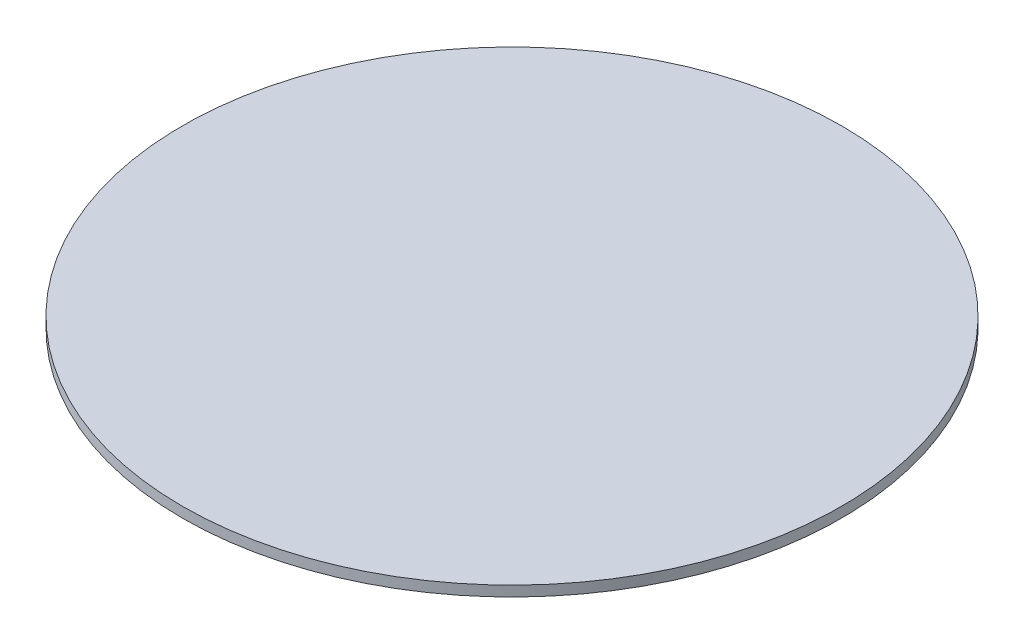
ISO-10303-21;
HEADER;
FILE_DESCRIPTION(('STEP AP214'),'2;1');
FILE_NAME('part.step','',(''),(''),'','','');
FILE_SCHEMA(('AUTOMOTIVE_DESIGN { 1 0 10303 214 1 1 1 1 }'));
ENDSEC;
DATA;
#1=APPLICATION_CONTEXT('core data for automotive mechanical design processes');
#2=APPLICATION_PROTOCOL_DEFINITION('international standard','automotive_design',2000,#1);
#3=PRODUCT_CONTEXT('',#1,'mechanical');
#4=PRODUCT('Part','Part','',(#3));
#5=PRODUCT_RELATED_PRODUCT_CATEGORY('part','',(#4));
#6=PRODUCT_DEFINITION_FORMATION('','',#4);
#7=PRODUCT_DEFINITION_CONTEXT('part definition',#1,'design');
#8=PRODUCT_DEFINITION('design','',#6,#7);
#9=PRODUCT_DEFINITION_SHAPE('','',#8);
#10=(LENGTH_UNIT() NAMED_UNIT(*) SI_UNIT(.MILLI.,.METRE.));
#11=(NAMED_UNIT(*) PLANE_ANGLE_UNIT() SI_UNIT($,.RADIAN.));
#12=(NAMED_UNIT(*) SI_UNIT($,.STERADIAN.) SOLID_ANGLE_UNIT());
#13=UNCERTAINTY_MEASURE_WITH_UNIT(LENGTH_MEASURE(1.E-05),#10,'distance_accuracy_value','');
#14=(GEOMETRIC_REPRESENTATION_CONTEXT(3) GLOBAL_UNCERTAINTY_ASSIGNED_CONTEXT((#13)) GLOBAL_UNIT_ASSIGNED_CONTEXT((#10,
#11,#12)) REPRESENTATION_CONTEXT('',''));
#15=CARTESIAN_POINT('',(0.,0.,0.));
#16=DIRECTION('',(0.,0.,1.));
#17=DIRECTION('',(1.,0.,0.));
#18=AXIS2_PLACEMENT_3D('',#15,#16,#17);
#19=CARTESIAN_POINT('',(0.,1.59,0.));
#20=DIRECTION('',(0.,-1.,0.));
#21=DIRECTION('',(0.,0.,-1.));
#22=AXIS2_PLACEMENT_3D('',#19,#20,#21);
#23=CYLINDRICAL_SURFACE('',#22,50.8);
#24=CARTESIAN_POINT('',(0.,1.59,0.));
#25=DIRECTION('',(0.,1.,0.));
#26=DIRECTION('',(0.,0.,1.));
#27=AXIS2_PLACEMENT_3D('',#24,#25,#26);
#28=CIRCLE('',#27,50.8);
#29=CARTESIAN_POINT('',(0.,1.59,-50.8));
#30=VERTEX_POINT('',#29);
#31=EDGE_CURVE('E10',#30,#30,#28,.T.);
#32=CARTESIAN_POINT('',(0.,0.,0.));
#33=DIRECTION('',(0.,1.,0.));
#34=DIRECTION('',(0.,0.,1.));
#35=AXIS2_PLACEMENT_3D('',#32,#33,#34);
#36=CIRCLE('',#35,50.8);
#37=CARTESIAN_POINT('',(0.,0.,-50.8));
#38=VERTEX_POINT('',#37);
#39=EDGE_CURVE('E35',#38,#38,#36,.T.);
#40=CARTESIAN_POINT('',(0.,1.59,-50.8));
#41=CARTESIAN_POINT('',(0.,1.5734375,-50.8));
#42=CARTESIAN_POINT('',(0.,1.556875,-50.8));
#43=CARTESIAN_POINT('',(0.,1.52375,-50.8));
#44=CARTESIAN_POINT('',(0.,1.5071875,-50.8));
#45=CARTESIAN_POINT('',(0.,1.4740625,-50.8));
#46=CARTESIAN_POINT('',(0.,1.4575,-50.8));
#47=CARTESIAN_POINT('',(0.,1.424375,-50.8));
#48=CARTESIAN_POINT('',(0.,1.4078125,-50.8));
#49=CARTESIAN_POINT('',(0.,1.3746875,-50.8));
#50=CARTESIAN_POINT('',(0.,1.358125,-50.8));
#51=CARTESIAN_POINT('',(0.,1.325,-50.8));
#52=CARTESIAN_POINT('',(0.,1.3084375,-50.8));
#53=CARTESIAN_POINT('',(0.,1.2753125,-50.8));
#54=CARTESIAN_POINT('',(0.,1.25875,-50.8));
#55=CARTESIAN_POINT('',(0.,1.225625,-50.8));
#56=CARTESIAN_POINT('',(0.,1.2090625,-50.8));
#57=CARTESIAN_POINT('',(0.,1.1759375,-50.8));
#58=CARTESIAN_POINT('',(0.,1.159375,-50.8));
#59=CARTESIAN_POINT('',(0.,1.12625,-50.8));
#60=CARTESIAN_POINT('',(0.,1.1096875,-50.8));
#61=CARTESIAN_POINT('',(0.,1.0765625,-50.8));
#62=CARTESIAN_POINT('',(0.,1.06,-50.8));
#63=CARTESIAN_POINT('',(0.,1.026875,-50.8));
#64=CARTESIAN_POINT('',(0.,1.0103125,-50.8));
#65=CARTESIAN_POINT('',(0.,0.9771875,-50.8));
#66=CARTESIAN_POINT('',(0.,0.960625,-50.8));
#67=CARTESIAN_POINT('',(0.,0.9275,-50.8));
#68=CARTESIAN_POINT('',(0.,0.9109375,-50.8));
#69=CARTESIAN_POINT('',(0.,0.8778125,-50.8));
#70=CARTESIAN_POINT('',(0.,0.86125,-50.8));
#71=CARTESIAN_POINT('',(0.,0.828125,-50.8));
#72=CARTESIAN_POINT('',(0.,0.8115625,-50.8));
#73=CARTESIAN_POINT('',(0.,0.7784375,-50.8));
#74=CARTESIAN_POINT('',(0.,0.761875,-50.8));
#75=CARTESIAN_POINT('',(0.,0.72875,-50.8));
#76=CARTESIAN_POINT('',(0.,0.7121875,-50.8));
#77=CARTESIAN_POINT('',(0.,0.6790625,-50.8));
#78=CARTESIAN_POINT('',(0.,0.6625,-50.8));
#79=CARTESIAN_POINT('',(0.,0.629375,-50.8));
#80=CARTESIAN_POINT('',(0.,0.6128125,-50.8));
#81=CARTESIAN_POINT('',(0.,0.5796875,-50.8));
#82=CARTESIAN_POINT('',(0.,0.563125,-50.8));
#83=CARTESIAN_POINT('',(0.,0.53,-50.8));
#84=CARTESIAN_POINT('',(0.,0.5134375,-50.8));
#85=CARTESIAN_POINT('',(0.,0.4803125,-50.8));
#86=CARTESIAN_POINT('',(0.,0.46375,-50.8));
#87=CARTESIAN_POINT('',(0.,0.430625,-50.8));
#88=CARTESIAN_POINT('',(0.,0.4140625,-50.8));
#89=CARTESIAN_POINT('',(0.,0.3809375,-50.8));
#90=CARTESIAN_POINT('',(0.,0.364375,-50.8));
#91=CARTESIAN_POINT('',(0.,0.33125,-50.8));
#92=CARTESIAN_POINT('',(0.,0.3146875,-50.8));
#93=CARTESIAN_POINT('',(0.,0.2815625,-50.8));
#94=CARTESIAN_POINT('',(0.,0.265,-50.8));
#95=CARTESIAN_POINT('',(0.,0.231875,-50.8));
#96=CARTESIAN_POINT('',(0.,0.2153125,-50.8));
#97=CARTESIAN_POINT('',(0.,0.1821875,-50.8));
#98=CARTESIAN_POINT('',(0.,0.165625,-50.8));
#99=CARTESIAN_POINT('',(0.,0.1325,-50.8));
#100=CARTESIAN_POINT('',(0.,0.1159375,-50.8));
#101=CARTESIAN_POINT('',(0.,0.0828125000000001,-50.8));
#102=CARTESIAN_POINT('',(0.,0.06625,-50.8));
#103=CARTESIAN_POINT('',(0.,0.033125,-50.8));
#104=CARTESIAN_POINT('',(0.,0.0165625,-50.8));
#105=CARTESIAN_POINT('',(0.,0.,-50.8));
#106=B_SPLINE_CURVE_WITH_KNOTS('',3,(#40,#41,#42,#43,#44,#45,#46,#47,#48,#49,#50,#51,#52,#53,
#54,#55,#56,#57,#58,#59,#60,#61,#62,#63,#64,#65,#66,#67,#68,#69,#70,#71,#72,#73,#74,#75,#76,#77,
#78,#79,#80,#81,#82,#83,#84,#85,#86,#87,#88,#89,#90,#91,#92,#93,#94,#95,#96,#97,#98,#99,#100,
#101,#102,#103,#104,#105),.UNSPECIFIED.,.F.,.F.,(4,2,2,2,2,2,2,2,2,2,2,2,2,2,2,2,2,2,2,2,2,2,2,
2,2,2,2,2,2,2,2,2,4),(0.,0.0496874999999998,0.0993749999999999,0.1490625,0.19875,0.2484375,
0.298125,0.3478125,0.3975,0.4471875,0.496875,0.5465625,0.59625,0.6459375,0.695625,0.7453125,
0.795,0.8446875,0.894375,0.9440625,0.99375,1.0434375,1.093125,1.1428125,1.1925,1.2421875,
1.291875,1.3415625,1.39125,1.4409375,1.490625,1.5403125,1.59),.UNSPECIFIED.);
#107=EDGE_CURVE('BSEAM32',#30,#38,#106,.T.);
#108=ORIENTED_EDGE('',*,*,#31,.F.);
#109=ORIENTED_EDGE('',*,*,#39,.T.);
#110=ORIENTED_EDGE('',*,*,#107,.T.);
#111=ORIENTED_EDGE('',*,*,#107,.F.);
#112=EDGE_LOOP('',(#108,#110,#109,#111));
#113=FACE_BOUND('',#112,.T.);
#114=ADVANCED_FACE('F32',(#113),#23,.T.);
#115=CARTESIAN_POINT('',(0.,1.59,0.));
#116=DIRECTION('',(0.,1.,0.));
#117=DIRECTION('',(0.,0.,1.));
#118=AXIS2_PLACEMENT_3D('',#115,#116,#117);
#119=PLANE('',#118);
#120=ORIENTED_EDGE('',*,*,#31,.T.);
#121=EDGE_LOOP('',(#120));
#122=FACE_BOUND('',#121,.T.);
#123=ADVANCED_FACE('F47',(#122),#119,.T.);
#124=CARTESIAN_POINT('',(0.,0.,0.));
#125=DIRECTION('',(0.,1.,0.));
#126=DIRECTION('',(0.,0.,1.));
#127=AXIS2_PLACEMENT_3D('',#124,#125,#126);
#128=PLANE('',#127);
#129=ORIENTED_EDGE('',*,*,#39,.F.);
#130=EDGE_LOOP('',(#129));
#131=FACE_BOUND('',#130,.T.);
#132=ADVANCED_FACE('F45',(#131),#128,.F.);
#133=CLOSED_SHELL('',(#114,#123,#132));
#134=MANIFOLD_SOLID_BREP('B2',#133);
#135=ADVANCED_BREP_SHAPE_REPRESENTATION('',(#18,#134),#14);
#136=SHAPE_DEFINITION_REPRESENTATION(#9,#135);
ENDSEC;
END-ISO-10303-21;
